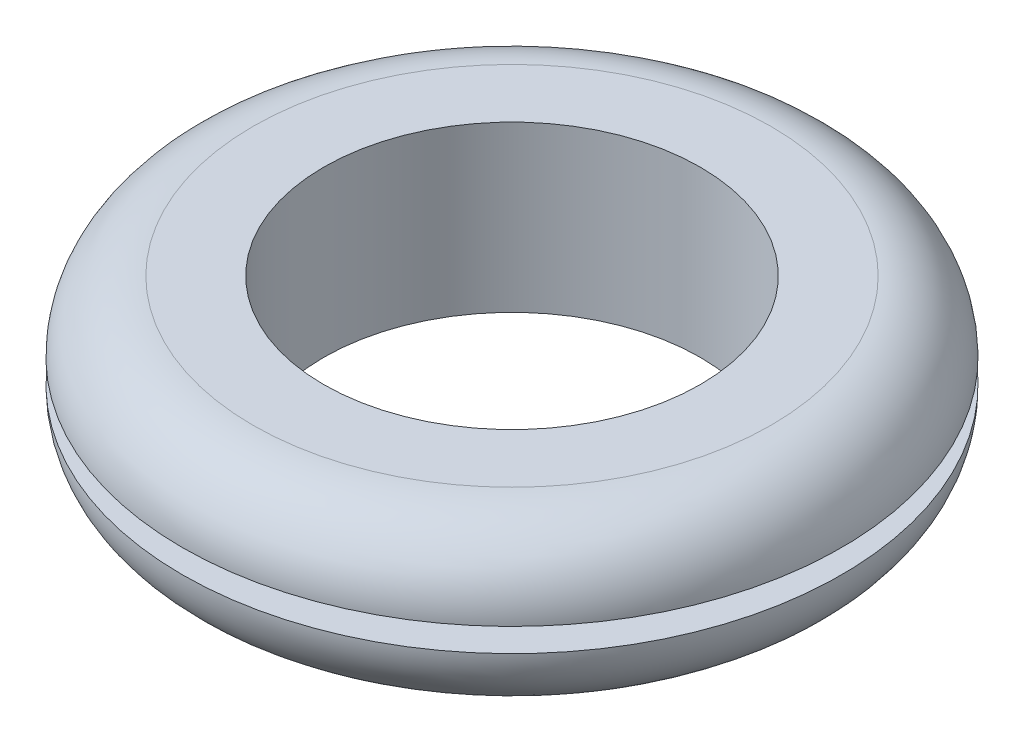
ISO-10303-21;
HEADER;
FILE_DESCRIPTION(('STEP AP214'),'2;1');
FILE_NAME('part.step','',(''),(''),'','','');
FILE_SCHEMA(('AUTOMOTIVE_DESIGN { 1 0 10303 214 1 1 1 1 }'));
ENDSEC;
DATA;
#1=APPLICATION_CONTEXT('core data for automotive mechanical design processes');
#2=APPLICATION_PROTOCOL_DEFINITION('international standard','automotive_design',2000,#1);
#3=PRODUCT_CONTEXT('',#1,'mechanical');
#4=PRODUCT('Part','Part','',(#3));
#5=PRODUCT_RELATED_PRODUCT_CATEGORY('part','',(#4));
#6=PRODUCT_DEFINITION_FORMATION('','',#4);
#7=PRODUCT_DEFINITION_CONTEXT('part definition',#1,'design');
#8=PRODUCT_DEFINITION('design','',#6,#7);
#9=PRODUCT_DEFINITION_SHAPE('','',#8);
#10=(LENGTH_UNIT() NAMED_UNIT(*) SI_UNIT(.MILLI.,.METRE.));
#11=(NAMED_UNIT(*) PLANE_ANGLE_UNIT() SI_UNIT($,.RADIAN.));
#12=(NAMED_UNIT(*) SI_UNIT($,.STERADIAN.) SOLID_ANGLE_UNIT());
#13=UNCERTAINTY_MEASURE_WITH_UNIT(LENGTH_MEASURE(1.E-05),#10,'distance_accuracy_value','');
#14=(GEOMETRIC_REPRESENTATION_CONTEXT(3) GLOBAL_UNCERTAINTY_ASSIGNED_CONTEXT((#13)) GLOBAL_UNIT_ASSIGNED_CONTEXT((#10,
#11,#12)) REPRESENTATION_CONTEXT('',''));
#15=CARTESIAN_POINT('',(0.,0.,0.));
#16=DIRECTION('',(0.,0.,1.));
#17=DIRECTION('',(1.,0.,0.));
#18=AXIS2_PLACEMENT_3D('',#15,#16,#17);
#19=CARTESIAN_POINT('',(0.,5.55625,0.));
#20=DIRECTION('',(0.,1.,0.));
#21=DIRECTION('',(0.,0.,1.));
#22=AXIS2_PLACEMENT_3D('',#19,#20,#21);
#23=CYLINDRICAL_SURFACE('',#22,17.4625);
#24=CARTESIAN_POINT('',(0.,0.79375,0.));
#25=DIRECTION('',(0.,1.,0.));
#26=DIRECTION('',(0.,0.,1.));
#27=AXIS2_PLACEMENT_3D('',#24,#25,#26);
#28=CIRCLE('',#27,17.4625);
#29=CARTESIAN_POINT('',(0.,0.79375,17.4625));
#30=VERTEX_POINT('',#29);
#31=EDGE_CURVE('E10',#30,#30,#28,.T.);
#32=ORIENTED_EDGE('',*,*,#31,.F.);
#33=EDGE_LOOP('',(#32));
#34=FACE_BOUND('',#33,.T.);
#35=CARTESIAN_POINT('',(0.,-0.79375,0.));
#36=DIRECTION('',(0.,1.,0.));
#37=DIRECTION('',(0.,0.,1.));
#38=AXIS2_PLACEMENT_3D('',#35,#36,#37);
#39=CIRCLE('',#38,17.4625);
#40=CARTESIAN_POINT('',(0.,-0.79375,17.4625));
#41=VERTEX_POINT('',#40);
#42=EDGE_CURVE('E60',#41,#41,#39,.T.);
#43=ORIENTED_EDGE('',*,*,#42,.T.);
#44=EDGE_LOOP('',(#43));
#45=FACE_BOUND('',#44,.T.);
#46=ADVANCED_FACE('F32',(#34,#45),#23,.T.);
#47=CARTESIAN_POINT('',(17.4625,0.79375,0.));
#48=DIRECTION('',(0.,1.,0.));
#49=DIRECTION('',(0.,0.,1.));
#50=AXIS2_PLACEMENT_3D('',#47,#48,#49);
#51=PLANE('',#50);
#52=CARTESIAN_POINT('',(0.,0.79375,0.));
#53=DIRECTION('',(0.,1.,0.));
#54=DIRECTION('',(0.,0.,1.));
#55=AXIS2_PLACEMENT_3D('',#52,#53,#54);
#56=CIRCLE('',#55,22.225);
#57=CARTESIAN_POINT('',(0.,0.79375,22.225));
#58=VERTEX_POINT('',#57);
#59=EDGE_CURVE('E38',#58,#58,#56,.T.);
#60=ORIENTED_EDGE('',*,*,#59,.F.);
#61=EDGE_LOOP('',(#60));
#62=FACE_BOUND('',#61,.T.);
#63=ORIENTED_EDGE('',*,*,#31,.T.);
#64=EDGE_LOOP('',(#63));
#65=FACE_BOUND('',#64,.T.);
#66=ADVANCED_FACE('F97',(#62,#65),#51,.F.);
#67=CARTESIAN_POINT('',(0.,0.79375,0.));
#68=DIRECTION('',(0.,1.,0.));
#69=DIRECTION('',(0.,0.,1.));
#70=AXIS2_PLACEMENT_3D('',#67,#68,#69);
#71=TOROIDAL_SURFACE('',#70,17.4625,4.7625);
#72=CARTESIAN_POINT('',(0.,5.55625,0.));
#73=DIRECTION('',(0.,1.,0.));
#74=DIRECTION('',(0.,0.,1.));
#75=AXIS2_PLACEMENT_3D('',#72,#73,#74);
#76=CIRCLE('',#75,17.4625);
#77=CARTESIAN_POINT('',(0.,5.55625,17.4625));
#78=VERTEX_POINT('',#77);
#79=EDGE_CURVE('E42',#78,#78,#76,.T.);
#80=ORIENTED_EDGE('',*,*,#79,.F.);
#81=EDGE_LOOP('',(#80));
#82=FACE_BOUND('',#81,.T.);
#83=ORIENTED_EDGE('',*,*,#59,.T.);
#84=EDGE_LOOP('',(#83));
#85=FACE_BOUND('',#84,.T.);
#86=ADVANCED_FACE('F92',(#82,#85),#71,.T.);
#87=CARTESIAN_POINT('',(12.7,5.55625,0.));
#88=DIRECTION('',(0.,-1.,0.));
#89=DIRECTION('',(0.,0.,-1.));
#90=AXIS2_PLACEMENT_3D('',#87,#88,#89);
#91=PLANE('',#90);
#92=CARTESIAN_POINT('',(0.,5.55625,0.));
#93=DIRECTION('',(0.,1.,0.));
#94=DIRECTION('',(0.,0.,1.));
#95=AXIS2_PLACEMENT_3D('',#92,#93,#94);
#96=CIRCLE('',#95,12.7);
#97=CARTESIAN_POINT('',(0.,5.55625,12.7));
#98=VERTEX_POINT('',#97);
#99=EDGE_CURVE('E46',#98,#98,#96,.T.);
#100=ORIENTED_EDGE('',*,*,#99,.F.);
#101=EDGE_LOOP('',(#100));
#102=FACE_BOUND('',#101,.T.);
#103=ORIENTED_EDGE('',*,*,#79,.T.);
#104=EDGE_LOOP('',(#103));
#105=FACE_BOUND('',#104,.T.);
#106=ADVANCED_FACE('F86',(#102,#105),#91,.F.);
#107=CARTESIAN_POINT('',(0.,5.55625,0.));
#108=DIRECTION('',(0.,1.,0.));
#109=DIRECTION('',(0.,0.,1.));
#110=AXIS2_PLACEMENT_3D('',#107,#108,#109);
#111=CYLINDRICAL_SURFACE('',#110,12.7);
#112=CARTESIAN_POINT('',(0.,-5.55625,0.));
#113=DIRECTION('',(0.,1.,0.));
#114=DIRECTION('',(0.,0.,1.));
#115=AXIS2_PLACEMENT_3D('',#112,#113,#114);
#116=CIRCLE('',#115,12.7);
#117=CARTESIAN_POINT('',(0.,-5.55625,12.7));
#118=VERTEX_POINT('',#117);
#119=EDGE_CURVE('E51',#118,#118,#116,.T.);
#120=ORIENTED_EDGE('',*,*,#119,.F.);
#121=EDGE_LOOP('',(#120));
#122=FACE_BOUND('',#121,.T.);
#123=ORIENTED_EDGE('',*,*,#99,.T.);
#124=EDGE_LOOP('',(#123));
#125=FACE_BOUND('',#124,.T.);
#126=ADVANCED_FACE('F80',(#122,#125),#111,.F.);
#127=CARTESIAN_POINT('',(12.7,-5.55625,0.));
#128=DIRECTION('',(0.,1.,0.));
#129=DIRECTION('',(0.,0.,1.));
#130=AXIS2_PLACEMENT_3D('',#127,#128,#129);
#131=PLANE('',#130);
#132=CARTESIAN_POINT('',(0.,-5.55625,0.));
#133=DIRECTION('',(0.,1.,0.));
#134=DIRECTION('',(0.,0.,1.));
#135=AXIS2_PLACEMENT_3D('',#132,#133,#134);
#136=CIRCLE('',#135,17.4625);
#137=CARTESIAN_POINT('',(0.,-5.55625,17.4625));
#138=VERTEX_POINT('',#137);
#139=EDGE_CURVE('E54',#138,#138,#136,.T.);
#140=ORIENTED_EDGE('',*,*,#139,.F.);
#141=EDGE_LOOP('',(#140));
#142=FACE_BOUND('',#141,.T.);
#143=ORIENTED_EDGE('',*,*,#119,.T.);
#144=EDGE_LOOP('',(#143));
#145=FACE_BOUND('',#144,.T.);
#146=ADVANCED_FACE('F74',(#142,#145),#131,.F.);
#147=CARTESIAN_POINT('',(0.,-0.79375,0.));
#148=DIRECTION('',(0.,1.,0.));
#149=DIRECTION('',(0.,0.,1.));
#150=AXIS2_PLACEMENT_3D('',#147,#148,#149);
#151=TOROIDAL_SURFACE('',#150,17.4625,4.7625);
#152=CARTESIAN_POINT('',(0.,-0.79375,0.));
#153=DIRECTION('',(0.,1.,0.));
#154=DIRECTION('',(0.,0.,1.));
#155=AXIS2_PLACEMENT_3D('',#152,#153,#154);
#156=CIRCLE('',#155,22.225);
#157=CARTESIAN_POINT('',(0.,-0.79375,22.225));
#158=VERTEX_POINT('',#157);
#159=EDGE_CURVE('E57',#158,#158,#156,.T.);
#160=ORIENTED_EDGE('',*,*,#159,.F.);
#161=EDGE_LOOP('',(#160));
#162=FACE_BOUND('',#161,.T.);
#163=ORIENTED_EDGE('',*,*,#139,.T.);
#164=EDGE_LOOP('',(#163));
#165=FACE_BOUND('',#164,.T.);
#166=ADVANCED_FACE('F68',(#162,#165),#151,.T.);
#167=CARTESIAN_POINT('',(22.225,-0.79375,0.));
#168=DIRECTION('',(0.,-1.,0.));
#169=DIRECTION('',(0.,0.,-1.));
#170=AXIS2_PLACEMENT_3D('',#167,#168,#169);
#171=PLANE('',#170);
#172=ORIENTED_EDGE('',*,*,#42,.F.);
#173=EDGE_LOOP('',(#172));
#174=FACE_BOUND('',#173,.T.);
#175=ORIENTED_EDGE('',*,*,#159,.T.);
#176=EDGE_LOOP('',(#175));
#177=FACE_BOUND('',#176,.T.);
#178=ADVANCED_FACE('F65',(#174,#177),#171,.F.);
#179=CLOSED_SHELL('',(#46,#66,#86,#106,#126,#146,#166,#178));
#180=MANIFOLD_SOLID_BREP('B2',#179);
#181=ADVANCED_BREP_SHAPE_REPRESENTATION('',(#18,#180),#14);
#182=SHAPE_DEFINITION_REPRESENTATION(#9,#181);
ENDSEC;
END-ISO-10303-21;
